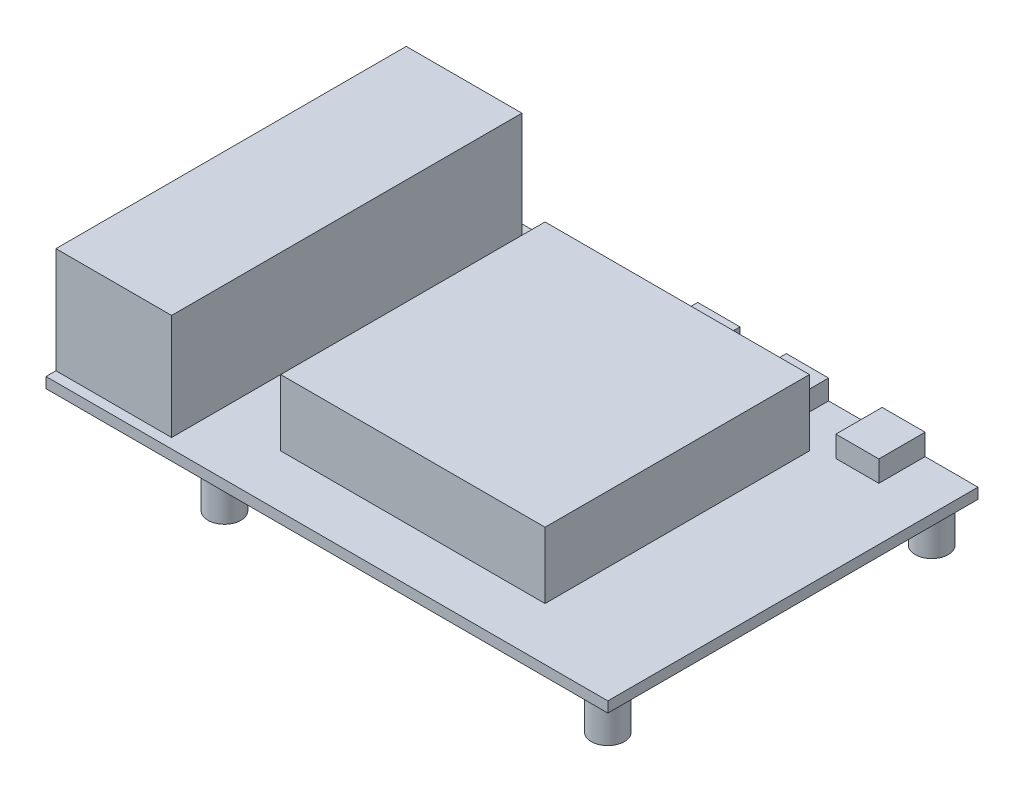
ISO-10303-21;
HEADER;
FILE_DESCRIPTION(('STEP AP214'),'2;1');
FILE_NAME('part.step','',(''),(''),'','','');
FILE_SCHEMA(('AUTOMOTIVE_DESIGN { 1 0 10303 214 1 1 1 1 }'));
ENDSEC;
DATA;
#1=APPLICATION_CONTEXT('core data for automotive mechanical design processes');
#2=APPLICATION_PROTOCOL_DEFINITION('international standard','automotive_design',2000,#1);
#3=PRODUCT_CONTEXT('',#1,'mechanical');
#4=PRODUCT('Part','Part','',(#3));
#5=PRODUCT_RELATED_PRODUCT_CATEGORY('part','',(#4));
#6=PRODUCT_DEFINITION_FORMATION('','',#4);
#7=PRODUCT_DEFINITION_CONTEXT('part definition',#1,'design');
#8=PRODUCT_DEFINITION('design','',#6,#7);
#9=PRODUCT_DEFINITION_SHAPE('','',#8);
#10=(LENGTH_UNIT() NAMED_UNIT(*) SI_UNIT(.MILLI.,.METRE.));
#11=(NAMED_UNIT(*) PLANE_ANGLE_UNIT() SI_UNIT($,.RADIAN.));
#12=(NAMED_UNIT(*) SI_UNIT($,.STERADIAN.) SOLID_ANGLE_UNIT());
#13=UNCERTAINTY_MEASURE_WITH_UNIT(LENGTH_MEASURE(1.E-05),#10,'distance_accuracy_value','');
#14=(GEOMETRIC_REPRESENTATION_CONTEXT(3) GLOBAL_UNCERTAINTY_ASSIGNED_CONTEXT((#13)) GLOBAL_UNIT_ASSIGNED_CONTEXT((#10,
#11,#12)) REPRESENTATION_CONTEXT('',''));
#15=CARTESIAN_POINT('',(0.,0.,0.));
#16=DIRECTION('',(0.,0.,1.));
#17=DIRECTION('',(1.,0.,0.));
#18=AXIS2_PLACEMENT_3D('',#15,#16,#17);
#19=CARTESIAN_POINT('',(-19.,6.,-24.5));
#20=DIRECTION('',(0.,-1.,0.));
#21=DIRECTION('',(0.,0.,-1.));
#22=AXIS2_PLACEMENT_3D('',#19,#20,#21);
#23=CYLINDRICAL_SURFACE('',#22,2.5);
#24=CARTESIAN_POINT('',(-19.,6.,-24.5));
#25=DIRECTION('',(0.,1.,0.));
#26=DIRECTION('',(0.,0.,1.));
#27=AXIS2_PLACEMENT_3D('',#24,#25,#26);
#28=CIRCLE('',#27,2.5);
#29=CARTESIAN_POINT('',(-19.,6.,-22.));
#30=VERTEX_POINT('',#29);
#31=EDGE_CURVE('E385',#30,#30,#28,.T.);
#32=ORIENTED_EDGE('',*,*,#31,.F.);
#33=EDGE_LOOP('',(#32));
#34=FACE_BOUND('',#33,.T.);
#35=CARTESIAN_POINT('',(-19.,0.,-24.5));
#36=DIRECTION('',(0.,1.,0.));
#37=DIRECTION('',(0.,0.,1.));
#38=AXIS2_PLACEMENT_3D('',#35,#36,#37);
#39=CIRCLE('',#38,2.5);
#40=CARTESIAN_POINT('',(-19.,0.,-22.));
#41=VERTEX_POINT('',#40);
#42=EDGE_CURVE('E381',#41,#41,#39,.T.);
#43=ORIENTED_EDGE('',*,*,#42,.T.);
#44=EDGE_LOOP('',(#43));
#45=FACE_BOUND('',#44,.T.);
#46=ADVANCED_FACE('F43',(#34,#45),#23,.T.);
#47=CARTESIAN_POINT('',(-19.,0.,-24.5));
#48=DIRECTION('',(0.,1.,0.));
#49=DIRECTION('',(0.,0.,1.));
#50=AXIS2_PLACEMENT_3D('',#47,#48,#49);
#51=PLANE('',#50);
#52=ORIENTED_EDGE('',*,*,#42,.F.);
#53=EDGE_LOOP('',(#52));
#54=FACE_BOUND('',#53,.T.);
#55=ADVANCED_FACE('F487',(#54),#51,.F.);
#56=CARTESIAN_POINT('',(-42.5,7.6,-28.));
#57=DIRECTION('',(1.,0.,0.));
#58=DIRECTION('',(0.,0.,-1.));
#59=AXIS2_PLACEMENT_3D('',#56,#57,#58);
#60=PLANE('',#59);
#61=DIRECTION('',(0.,0.,1.));
#62=VECTOR('',#61,1.);
#63=CARTESIAN_POINT('',(-42.5,6.,-28.));
#64=LINE('',#63,#62);
#65=CARTESIAN_POINT('',(-42.5,6.,-28.));
#66=VERTEX_POINT('',#65);
#67=CARTESIAN_POINT('',(-42.5,6.,28.));
#68=VERTEX_POINT('',#67);
#69=EDGE_CURVE('E350',#66,#68,#64,.T.);
#70=ORIENTED_EDGE('',*,*,#69,.T.);
#71=DIRECTION('',(0.,-1.,0.));
#72=VECTOR('',#71,1.);
#73=CARTESIAN_POINT('',(-42.5,7.6,28.));
#74=LINE('',#73,#72);
#75=CARTESIAN_POINT('',(-42.5,7.6,28.));
#76=VERTEX_POINT('',#75);
#77=EDGE_CURVE('E378',#76,#68,#74,.T.);
#78=ORIENTED_EDGE('',*,*,#77,.F.);
#79=DIRECTION('',(0.,0.,1.));
#80=VECTOR('',#79,1.);
#81=CARTESIAN_POINT('',(-42.5,7.6,-28.));
#82=LINE('',#81,#80);
#83=CARTESIAN_POINT('',(-42.5,7.6,26.5));
#84=VERTEX_POINT('',#83);
#85=EDGE_CURVE('E352',#84,#76,#82,.T.);
#86=ORIENTED_EDGE('',*,*,#85,.F.);
#87=DIRECTION('',(0.,-1.,0.));
#88=VECTOR('',#87,1.);
#89=CARTESIAN_POINT('',(-42.5,23.6,26.5));
#90=LINE('',#89,#88);
#91=CARTESIAN_POINT('',(-42.5,23.6,26.5));
#92=VERTEX_POINT('',#91);
#93=EDGE_CURVE('E304',#92,#84,#90,.T.);
#94=ORIENTED_EDGE('',*,*,#93,.F.);
#95=DIRECTION('',(0.,0.,1.));
#96=VECTOR('',#95,1.);
#97=CARTESIAN_POINT('',(-42.5,23.6,-26.5));
#98=LINE('',#97,#96);
#99=CARTESIAN_POINT('',(-42.5,23.6,-26.5));
#100=VERTEX_POINT('',#99);
#101=EDGE_CURVE('E278',#100,#92,#98,.T.);
#102=ORIENTED_EDGE('',*,*,#101,.F.);
#103=DIRECTION('',(0.,-1.,0.));
#104=VECTOR('',#103,1.);
#105=CARTESIAN_POINT('',(-42.5,23.6,-26.5));
#106=LINE('',#105,#104);
#107=CARTESIAN_POINT('',(-42.5,7.6,-26.5));
#108=VERTEX_POINT('',#107);
#109=EDGE_CURVE('E290',#100,#108,#106,.T.);
#110=ORIENTED_EDGE('',*,*,#109,.T.);
#111=CARTESIAN_POINT('',(-42.5,7.6,-28.));
#112=VERTEX_POINT('',#111);
#113=EDGE_CURVE('E346',#112,#108,#82,.T.);
#114=ORIENTED_EDGE('',*,*,#113,.F.);
#115=DIRECTION('',(0.,-1.,0.));
#116=VECTOR('',#115,1.);
#117=CARTESIAN_POINT('',(-42.5,7.6,-28.));
#118=LINE('',#117,#116);
#119=EDGE_CURVE('E360',#112,#66,#118,.T.);
#120=ORIENTED_EDGE('',*,*,#119,.T.);
#121=EDGE_LOOP('',(#70,#78,#86,#94,#102,#110,#114,#120));
#122=FACE_BOUND('',#121,.T.);
#123=ADVANCED_FACE('F411',(#122),#60,.F.);
#124=CARTESIAN_POINT('',(-42.5,7.6,28.));
#125=DIRECTION('',(0.,0.,-1.));
#126=DIRECTION('',(-1.,0.,0.));
#127=AXIS2_PLACEMENT_3D('',#124,#125,#126);
#128=PLANE('',#127);
#129=DIRECTION('',(1.,0.,0.));
#130=VECTOR('',#129,1.);
#131=CARTESIAN_POINT('',(-42.5,6.,28.));
#132=LINE('',#131,#130);
#133=CARTESIAN_POINT('',(42.5,6.,28.));
#134=VERTEX_POINT('',#133);
#135=EDGE_CURVE('E365',#68,#134,#132,.T.);
#136=ORIENTED_EDGE('',*,*,#135,.T.);
#137=DIRECTION('',(0.,-1.,0.));
#138=VECTOR('',#137,1.);
#139=CARTESIAN_POINT('',(42.5,7.6,28.));
#140=LINE('',#139,#138);
#141=CARTESIAN_POINT('',(42.5,7.6,28.));
#142=VERTEX_POINT('',#141);
#143=EDGE_CURVE('E374',#142,#134,#140,.T.);
#144=ORIENTED_EDGE('',*,*,#143,.F.);
#145=DIRECTION('',(1.,0.,0.));
#146=VECTOR('',#145,1.);
#147=CARTESIAN_POINT('',(-42.5,7.6,28.));
#148=LINE('',#147,#146);
#149=EDGE_CURVE('E351',#76,#142,#148,.T.);
#150=ORIENTED_EDGE('',*,*,#149,.F.);
#151=ORIENTED_EDGE('',*,*,#77,.T.);
#152=EDGE_LOOP('',(#136,#144,#150,#151));
#153=FACE_BOUND('',#152,.T.);
#154=ADVANCED_FACE('F426',(#153),#128,.F.);
#155=CARTESIAN_POINT('',(42.5,7.6,28.));
#156=DIRECTION('',(-1.,0.,0.));
#157=DIRECTION('',(0.,0.,1.));
#158=AXIS2_PLACEMENT_3D('',#155,#156,#157);
#159=PLANE('',#158);
#160=DIRECTION('',(0.,0.,-1.));
#161=VECTOR('',#160,1.);
#162=CARTESIAN_POINT('',(42.5,6.,28.));
#163=LINE('',#162,#161);
#164=CARTESIAN_POINT('',(42.5,6.,-28.));
#165=VERTEX_POINT('',#164);
#166=EDGE_CURVE('E368',#134,#165,#163,.T.);
#167=ORIENTED_EDGE('',*,*,#166,.T.);
#168=DIRECTION('',(0.,-1.,0.));
#169=VECTOR('',#168,1.);
#170=CARTESIAN_POINT('',(42.5,7.6,-28.));
#171=LINE('',#170,#169);
#172=CARTESIAN_POINT('',(42.5,7.6,-28.));
#173=VERTEX_POINT('',#172);
#174=EDGE_CURVE('E375',#173,#165,#171,.T.);
#175=ORIENTED_EDGE('',*,*,#174,.F.);
#176=DIRECTION('',(0.,0.,-1.));
#177=VECTOR('',#176,1.);
#178=CARTESIAN_POINT('',(42.5,7.6,28.));
#179=LINE('',#178,#177);
#180=EDGE_CURVE('E353',#142,#173,#179,.T.);
#181=ORIENTED_EDGE('',*,*,#180,.F.);
#182=ORIENTED_EDGE('',*,*,#143,.T.);
#183=EDGE_LOOP('',(#167,#175,#181,#182));
#184=FACE_BOUND('',#183,.T.);
#185=ADVANCED_FACE('F425',(#184),#159,.F.);
#186=CARTESIAN_POINT('',(42.5,7.6,-28.));
#187=DIRECTION('',(0.,0.,1.));
#188=DIRECTION('',(1.,0.,0.));
#189=AXIS2_PLACEMENT_3D('',#186,#187,#188);
#190=PLANE('',#189);
#191=DIRECTION('',(-1.,0.,0.));
#192=VECTOR('',#191,1.);
#193=CARTESIAN_POINT('',(42.5,6.,-28.));
#194=LINE('',#193,#192);
#195=EDGE_CURVE('E366',#165,#66,#194,.T.);
#196=ORIENTED_EDGE('',*,*,#195,.T.);
#197=ORIENTED_EDGE('',*,*,#119,.F.);
#198=DIRECTION('',(-1.,0.,0.));
#199=VECTOR('',#198,1.);
#200=CARTESIAN_POINT('',(42.5,7.6,-28.));
#201=LINE('',#200,#199);
#202=CARTESIAN_POINT('',(0.1,7.6,-28.));
#203=VERTEX_POINT('',#202);
#204=EDGE_CURVE('E356',#203,#112,#201,.T.);
#205=ORIENTED_EDGE('',*,*,#204,.F.);
#206=DIRECTION('',(0.,-1.,0.));
#207=VECTOR('',#206,1.);
#208=CARTESIAN_POINT('',(0.1,10.6,-28.));
#209=LINE('',#208,#207);
#210=CARTESIAN_POINT('',(0.1,10.6,-28.));
#211=VERTEX_POINT('',#210);
#212=EDGE_CURVE('E473',#211,#203,#209,.T.);
#213=ORIENTED_EDGE('',*,*,#212,.F.);
#214=DIRECTION('',(-1.,0.,0.));
#215=VECTOR('',#214,1.);
#216=CARTESIAN_POINT('',(6.5,10.6,-28.));
#217=LINE('',#216,#215);
#218=CARTESIAN_POINT('',(6.5,10.6,-28.));
#219=VERTEX_POINT('',#218);
#220=EDGE_CURVE('E218',#219,#211,#217,.T.);
#221=ORIENTED_EDGE('',*,*,#220,.F.);
#222=DIRECTION('',(0.,-1.,0.));
#223=VECTOR('',#222,1.);
#224=CARTESIAN_POINT('',(6.5,10.6,-28.));
#225=LINE('',#224,#223);
#226=CARTESIAN_POINT('',(6.5,7.6,-28.));
#227=VERTEX_POINT('',#226);
#228=EDGE_CURVE('E227',#219,#227,#225,.T.);
#229=ORIENTED_EDGE('',*,*,#228,.T.);
#230=CARTESIAN_POINT('',(13.5,7.6,-28.));
#231=VERTEX_POINT('',#230);
#232=EDGE_CURVE('E443',#231,#227,#201,.T.);
#233=ORIENTED_EDGE('',*,*,#232,.F.);
#234=DIRECTION('',(0.,-1.,0.));
#235=VECTOR('',#234,1.);
#236=CARTESIAN_POINT('',(13.5,10.6,-28.));
#237=LINE('',#236,#235);
#238=CARTESIAN_POINT('',(13.5,10.6,-28.));
#239=VERTEX_POINT('',#238);
#240=EDGE_CURVE('E238',#239,#231,#237,.T.);
#241=ORIENTED_EDGE('',*,*,#240,.F.);
#242=DIRECTION('',(-1.,0.,0.));
#243=VECTOR('',#242,1.);
#244=CARTESIAN_POINT('',(19.9,10.6,-28.));
#245=LINE('',#244,#243);
#246=CARTESIAN_POINT('',(19.9,10.6,-28.));
#247=VERTEX_POINT('',#246);
#248=EDGE_CURVE('E239',#247,#239,#245,.T.);
#249=ORIENTED_EDGE('',*,*,#248,.F.);
#250=DIRECTION('',(0.,-1.,0.));
#251=VECTOR('',#250,1.);
#252=CARTESIAN_POINT('',(19.9,10.6,-28.));
#253=LINE('',#252,#251);
#254=CARTESIAN_POINT('',(19.9,7.6,-28.));
#255=VERTEX_POINT('',#254);
#256=EDGE_CURVE('E245',#247,#255,#253,.T.);
#257=ORIENTED_EDGE('',*,*,#256,.T.);
#258=CARTESIAN_POINT('',(28.,7.6,-28.));
#259=VERTEX_POINT('',#258);
#260=EDGE_CURVE('E363',#259,#255,#201,.T.);
#261=ORIENTED_EDGE('',*,*,#260,.F.);
#262=DIRECTION('',(0.,-1.,0.));
#263=VECTOR('',#262,1.);
#264=CARTESIAN_POINT('',(28.,10.8,-28.));
#265=LINE('',#264,#263);
#266=CARTESIAN_POINT('',(28.,10.8,-28.));
#267=VERTEX_POINT('',#266);
#268=EDGE_CURVE('E262',#267,#259,#265,.T.);
#269=ORIENTED_EDGE('',*,*,#268,.F.);
#270=DIRECTION('',(-1.,0.,0.));
#271=VECTOR('',#270,1.);
#272=CARTESIAN_POINT('',(34.5,10.8,-28.));
#273=LINE('',#272,#271);
#274=CARTESIAN_POINT('',(34.5,10.8,-28.));
#275=VERTEX_POINT('',#274);
#276=EDGE_CURVE('E265',#275,#267,#273,.T.);
#277=ORIENTED_EDGE('',*,*,#276,.F.);
#278=DIRECTION('',(0.,-1.,0.));
#279=VECTOR('',#278,1.);
#280=CARTESIAN_POINT('',(34.5,10.8,-28.));
#281=LINE('',#280,#279);
#282=CARTESIAN_POINT('',(34.5,7.6,-28.));
#283=VERTEX_POINT('',#282);
#284=EDGE_CURVE('E269',#275,#283,#281,.T.);
#285=ORIENTED_EDGE('',*,*,#284,.T.);
#286=EDGE_CURVE('E357',#173,#283,#201,.T.);
#287=ORIENTED_EDGE('',*,*,#286,.F.);
#288=ORIENTED_EDGE('',*,*,#174,.T.);
#289=EDGE_LOOP('',(#196,#197,#205,#213,#221,#229,#233,#241,#249,#257,#261,#269,#277,#285,#287,#288));
#290=FACE_BOUND('',#289,.T.);
#291=ADVANCED_FACE('F417',(#290),#190,.F.);
#292=CARTESIAN_POINT('',(0.,7.6,0.));
#293=DIRECTION('',(0.,1.,0.));
#294=DIRECTION('',(0.,0.,1.));
#295=AXIS2_PLACEMENT_3D('',#292,#293,#294);
#296=PLANE('',#295);
#297=DIRECTION('',(0.,0.,1.));
#298=VECTOR('',#297,1.);
#299=CARTESIAN_POINT('',(0.1,7.6,-28.));
#300=LINE('',#299,#298);
#301=CARTESIAN_POINT('',(0.1,7.6,-21.));
#302=VERTEX_POINT('',#301);
#303=EDGE_CURVE('E60',#203,#302,#300,.T.);
#304=ORIENTED_EDGE('',*,*,#303,.F.);
#305=ORIENTED_EDGE('',*,*,#204,.T.);
#306=ORIENTED_EDGE('',*,*,#113,.T.);
#307=DIRECTION('',(-1.,0.,0.));
#308=VECTOR('',#307,1.);
#309=CARTESIAN_POINT('',(-25.,7.6,-26.5));
#310=LINE('',#309,#308);
#311=CARTESIAN_POINT('',(-25.,7.6,-26.5));
#312=VERTEX_POINT('',#311);
#313=EDGE_CURVE('E283',#312,#108,#310,.T.);
#314=ORIENTED_EDGE('',*,*,#313,.F.);
#315=DIRECTION('',(0.,0.,-1.));
#316=VECTOR('',#315,1.);
#317=CARTESIAN_POINT('',(-25.,7.6,26.5));
#318=LINE('',#317,#316);
#319=CARTESIAN_POINT('',(-25.,7.6,26.5));
#320=VERTEX_POINT('',#319);
#321=EDGE_CURVE('E291',#320,#312,#318,.T.);
#322=ORIENTED_EDGE('',*,*,#321,.F.);
#323=DIRECTION('',(1.,0.,0.));
#324=VECTOR('',#323,1.);
#325=CARTESIAN_POINT('',(-42.5,7.6,26.5));
#326=LINE('',#325,#324);
#327=EDGE_CURVE('E276',#84,#320,#326,.T.);
#328=ORIENTED_EDGE('',*,*,#327,.F.);
#329=ORIENTED_EDGE('',*,*,#85,.T.);
#330=ORIENTED_EDGE('',*,*,#149,.T.);
#331=ORIENTED_EDGE('',*,*,#180,.T.);
#332=ORIENTED_EDGE('',*,*,#286,.T.);
#333=DIRECTION('',(0.,0.,-1.));
#334=VECTOR('',#333,1.);
#335=CARTESIAN_POINT('',(34.5,7.6,-21.));
#336=LINE('',#335,#334);
#337=CARTESIAN_POINT('',(34.5,7.6,-21.));
#338=VERTEX_POINT('',#337);
#339=EDGE_CURVE('E256',#338,#283,#336,.T.);
#340=ORIENTED_EDGE('',*,*,#339,.F.);
#341=DIRECTION('',(1.,0.,0.));
#342=VECTOR('',#341,1.);
#343=CARTESIAN_POINT('',(28.,7.6,-21.));
#344=LINE('',#343,#342);
#345=CARTESIAN_POINT('',(28.,7.6,-21.));
#346=VERTEX_POINT('',#345);
#347=EDGE_CURVE('E266',#346,#338,#344,.T.);
#348=ORIENTED_EDGE('',*,*,#347,.F.);
#349=DIRECTION('',(0.,0.,1.));
#350=VECTOR('',#349,1.);
#351=CARTESIAN_POINT('',(28.,7.6,-28.));
#352=LINE('',#351,#350);
#353=EDGE_CURVE('E251',#259,#346,#352,.T.);
#354=ORIENTED_EDGE('',*,*,#353,.F.);
#355=ORIENTED_EDGE('',*,*,#260,.T.);
#356=DIRECTION('',(0.,0.,-1.));
#357=VECTOR('',#356,1.);
#358=CARTESIAN_POINT('',(19.9,7.6,-21.));
#359=LINE('',#358,#357);
#360=CARTESIAN_POINT('',(19.9,7.6,-21.));
#361=VERTEX_POINT('',#360);
#362=EDGE_CURVE('E235',#361,#255,#359,.T.);
#363=ORIENTED_EDGE('',*,*,#362,.F.);
#364=DIRECTION('',(1.,0.,0.));
#365=VECTOR('',#364,1.);
#366=CARTESIAN_POINT('',(13.5,7.6,-21.));
#367=LINE('',#366,#365);
#368=CARTESIAN_POINT('',(13.5,7.6,-21.));
#369=VERTEX_POINT('',#368);
#370=EDGE_CURVE('E223',#369,#361,#367,.T.);
#371=ORIENTED_EDGE('',*,*,#370,.F.);
#372=DIRECTION('',(0.,0.,1.));
#373=VECTOR('',#372,1.);
#374=CARTESIAN_POINT('',(13.5,7.6,-28.));
#375=LINE('',#374,#373);
#376=EDGE_CURVE('E65',#231,#369,#375,.T.);
#377=ORIENTED_EDGE('',*,*,#376,.F.);
#378=ORIENTED_EDGE('',*,*,#232,.T.);
#379=DIRECTION('',(0.,0.,-1.));
#380=VECTOR('',#379,1.);
#381=CARTESIAN_POINT('',(6.5,7.6,-21.));
#382=LINE('',#381,#380);
#383=CARTESIAN_POINT('',(6.5,7.6,-21.));
#384=VERTEX_POINT('',#383);
#385=EDGE_CURVE('E222',#384,#227,#382,.T.);
#386=ORIENTED_EDGE('',*,*,#385,.F.);
#387=DIRECTION('',(1.,0.,0.));
#388=VECTOR('',#387,1.);
#389=CARTESIAN_POINT('',(0.1,7.6,-21.));
#390=LINE('',#389,#388);
#391=EDGE_CURVE('E474',#302,#384,#390,.T.);
#392=ORIENTED_EDGE('',*,*,#391,.F.);
#393=EDGE_LOOP('',(#304,#305,#306,#314,#322,#328,#329,#330,#331,#332,#340,#348,#354,#355,#363,
#371,#377,#378,#386,#392));
#394=FACE_BOUND('',#393,.T.);
#395=DIRECTION('',(0.,0.,1.));
#396=VECTOR('',#395,1.);
#397=CARTESIAN_POINT('',(-15.,7.6,-20.));
#398=LINE('',#397,#396);
#399=CARTESIAN_POINT('',(-15.,7.6,-20.));
#400=VERTEX_POINT('',#399);
#401=CARTESIAN_POINT('',(-15.,7.6,20.));
#402=VERTEX_POINT('',#401);
#403=EDGE_CURVE('E305',#400,#402,#398,.T.);
#404=ORIENTED_EDGE('',*,*,#403,.F.);
#405=DIRECTION('',(-1.,0.,0.));
#406=VECTOR('',#405,1.);
#407=CARTESIAN_POINT('',(25.,7.6,-20.));
#408=LINE('',#407,#406);
#409=CARTESIAN_POINT('',(25.,7.6,-20.));
#410=VERTEX_POINT('',#409);
#411=EDGE_CURVE('E309',#410,#400,#408,.T.);
#412=ORIENTED_EDGE('',*,*,#411,.F.);
#413=DIRECTION('',(0.,0.,-1.));
#414=VECTOR('',#413,1.);
#415=CARTESIAN_POINT('',(25.,7.6,20.));
#416=LINE('',#415,#414);
#417=CARTESIAN_POINT('',(25.,7.6,20.));
#418=VERTEX_POINT('',#417);
#419=EDGE_CURVE('E325',#418,#410,#416,.T.);
#420=ORIENTED_EDGE('',*,*,#419,.F.);
#421=DIRECTION('',(1.,0.,0.));
#422=VECTOR('',#421,1.);
#423=CARTESIAN_POINT('',(-15.,7.6,20.));
#424=LINE('',#423,#422);
#425=EDGE_CURVE('E317',#402,#418,#424,.T.);
#426=ORIENTED_EDGE('',*,*,#425,.F.);
#427=EDGE_LOOP('',(#404,#412,#420,#426));
#428=FACE_BOUND('',#427,.T.);
#429=ADVANCED_FACE('F398',(#394,#428),#296,.T.);
#430=CARTESIAN_POINT('',(0.,6.,0.));
#431=DIRECTION('',(0.,1.,0.));
#432=DIRECTION('',(0.,0.,1.));
#433=AXIS2_PLACEMENT_3D('',#430,#431,#432);
#434=PLANE('',#433);
#435=CARTESIAN_POINT('',(39.,6.,24.5));
#436=DIRECTION('',(0.,1.,0.));
#437=DIRECTION('',(0.,0.,1.));
#438=AXIS2_PLACEMENT_3D('',#435,#436,#437);
#439=CIRCLE('',#438,2.5);
#440=CARTESIAN_POINT('',(39.,6.,27.));
#441=VERTEX_POINT('',#440);
#442=EDGE_CURVE('E11',#441,#441,#439,.F.);
#443=ORIENTED_EDGE('',*,*,#442,.F.);
#444=EDGE_LOOP('',(#443));
#445=FACE_BOUND('',#444,.T.);
#446=CARTESIAN_POINT('',(39.,6.,-24.5));
#447=DIRECTION('',(0.,1.,0.));
#448=DIRECTION('',(0.,0.,1.));
#449=AXIS2_PLACEMENT_3D('',#446,#447,#448);
#450=CIRCLE('',#449,2.5);
#451=CARTESIAN_POINT('',(39.,6.,-22.));
#452=VERTEX_POINT('',#451);
#453=EDGE_CURVE('E49',#452,#452,#450,.F.);
#454=ORIENTED_EDGE('',*,*,#453,.F.);
#455=EDGE_LOOP('',(#454));
#456=FACE_BOUND('',#455,.T.);
#457=CARTESIAN_POINT('',(-19.,6.,24.5));
#458=DIRECTION('',(0.,1.,0.));
#459=DIRECTION('',(0.,0.,1.));
#460=AXIS2_PLACEMENT_3D('',#457,#458,#459);
#461=CIRCLE('',#460,2.5);
#462=CARTESIAN_POINT('',(-19.,6.,27.));
#463=VERTEX_POINT('',#462);
#464=EDGE_CURVE('E384',#463,#463,#461,.F.);
#465=ORIENTED_EDGE('',*,*,#464,.F.);
#466=EDGE_LOOP('',(#465));
#467=FACE_BOUND('',#466,.T.);
#468=ORIENTED_EDGE('',*,*,#31,.T.);
#469=EDGE_LOOP('',(#468));
#470=FACE_BOUND('',#469,.T.);
#471=ORIENTED_EDGE('',*,*,#69,.F.);
#472=ORIENTED_EDGE('',*,*,#195,.F.);
#473=ORIENTED_EDGE('',*,*,#166,.F.);
#474=ORIENTED_EDGE('',*,*,#135,.F.);
#475=EDGE_LOOP('',(#471,#472,#473,#474));
#476=FACE_BOUND('',#475,.T.);
#477=ADVANCED_FACE('F395',(#445,#456,#467,#470,#476),#434,.F.);
#478=CARTESIAN_POINT('',(-19.,6.,24.5));
#479=DIRECTION('',(0.,-1.,0.));
#480=DIRECTION('',(0.,0.,-1.));
#481=AXIS2_PLACEMENT_3D('',#478,#479,#480);
#482=CYLINDRICAL_SURFACE('',#481,2.5);
#483=ORIENTED_EDGE('',*,*,#464,.T.);
#484=EDGE_LOOP('',(#483));
#485=FACE_BOUND('',#484,.T.);
#486=CARTESIAN_POINT('',(-19.,0.,24.5));
#487=DIRECTION('',(0.,1.,0.));
#488=DIRECTION('',(0.,0.,1.));
#489=AXIS2_PLACEMENT_3D('',#486,#487,#488);
#490=CIRCLE('',#489,2.5);
#491=CARTESIAN_POINT('',(-19.,0.,27.));
#492=VERTEX_POINT('',#491);
#493=EDGE_CURVE('E343',#492,#492,#490,.T.);
#494=ORIENTED_EDGE('',*,*,#493,.T.);
#495=EDGE_LOOP('',(#494));
#496=FACE_BOUND('',#495,.T.);
#497=ADVANCED_FACE('F399',(#485,#496),#482,.T.);
#498=CARTESIAN_POINT('',(-19.,0.,24.5));
#499=DIRECTION('',(0.,1.,0.));
#500=DIRECTION('',(0.,0.,1.));
#501=AXIS2_PLACEMENT_3D('',#498,#499,#500);
#502=PLANE('',#501);
#503=ORIENTED_EDGE('',*,*,#493,.F.);
#504=EDGE_LOOP('',(#503));
#505=FACE_BOUND('',#504,.T.);
#506=ADVANCED_FACE('F515',(#505),#502,.F.);
#507=CARTESIAN_POINT('',(39.,6.,-24.5));
#508=DIRECTION('',(0.,-1.,0.));
#509=DIRECTION('',(0.,0.,-1.));
#510=AXIS2_PLACEMENT_3D('',#507,#508,#509);
#511=CYLINDRICAL_SURFACE('',#510,2.5);
#512=ORIENTED_EDGE('',*,*,#453,.T.);
#513=EDGE_LOOP('',(#512));
#514=FACE_BOUND('',#513,.T.);
#515=CARTESIAN_POINT('',(39.,0.,-24.5));
#516=DIRECTION('',(0.,1.,0.));
#517=DIRECTION('',(0.,0.,1.));
#518=AXIS2_PLACEMENT_3D('',#515,#516,#517);
#519=CIRCLE('',#518,2.5);
#520=CARTESIAN_POINT('',(39.,0.,-22.));
#521=VERTEX_POINT('',#520);
#522=EDGE_CURVE('E341',#521,#521,#519,.T.);
#523=ORIENTED_EDGE('',*,*,#522,.T.);
#524=EDGE_LOOP('',(#523));
#525=FACE_BOUND('',#524,.T.);
#526=ADVANCED_FACE('F392',(#514,#525),#511,.T.);
#527=CARTESIAN_POINT('',(39.,0.,-24.5));
#528=DIRECTION('',(0.,1.,0.));
#529=DIRECTION('',(0.,0.,1.));
#530=AXIS2_PLACEMENT_3D('',#527,#528,#529);
#531=PLANE('',#530);
#532=ORIENTED_EDGE('',*,*,#522,.F.);
#533=EDGE_LOOP('',(#532));
#534=FACE_BOUND('',#533,.T.);
#535=ADVANCED_FACE('F518',(#534),#531,.F.);
#536=CARTESIAN_POINT('',(39.,6.,24.5));
#537=DIRECTION('',(0.,-1.,0.));
#538=DIRECTION('',(0.,0.,-1.));
#539=AXIS2_PLACEMENT_3D('',#536,#537,#538);
#540=CYLINDRICAL_SURFACE('',#539,2.5);
#541=ORIENTED_EDGE('',*,*,#442,.T.);
#542=EDGE_LOOP('',(#541));
#543=FACE_BOUND('',#542,.T.);
#544=CARTESIAN_POINT('',(39.,0.,24.5));
#545=DIRECTION('',(0.,1.,0.));
#546=DIRECTION('',(0.,0.,1.));
#547=AXIS2_PLACEMENT_3D('',#544,#545,#546);
#548=CIRCLE('',#547,2.5);
#549=CARTESIAN_POINT('',(39.,0.,27.));
#550=VERTEX_POINT('',#549);
#551=EDGE_CURVE('E339',#550,#550,#548,.T.);
#552=ORIENTED_EDGE('',*,*,#551,.T.);
#553=EDGE_LOOP('',(#552));
#554=FACE_BOUND('',#553,.T.);
#555=ADVANCED_FACE('F522',(#543,#554),#540,.T.);
#556=CARTESIAN_POINT('',(39.,0.,24.5));
#557=DIRECTION('',(0.,1.,0.));
#558=DIRECTION('',(0.,0.,1.));
#559=AXIS2_PLACEMENT_3D('',#556,#557,#558);
#560=PLANE('',#559);
#561=ORIENTED_EDGE('',*,*,#551,.F.);
#562=EDGE_LOOP('',(#561));
#563=FACE_BOUND('',#562,.T.);
#564=ADVANCED_FACE('F528',(#563),#560,.F.);
#565=CARTESIAN_POINT('',(-15.,17.6,-20.));
#566=DIRECTION('',(1.,0.,0.));
#567=DIRECTION('',(0.,0.,-1.));
#568=AXIS2_PLACEMENT_3D('',#565,#566,#567);
#569=PLANE('',#568);
#570=ORIENTED_EDGE('',*,*,#403,.T.);
#571=DIRECTION('',(0.,-1.,0.));
#572=VECTOR('',#571,1.);
#573=CARTESIAN_POINT('',(-15.,17.6,20.));
#574=LINE('',#573,#572);
#575=CARTESIAN_POINT('',(-15.,17.6,20.));
#576=VERTEX_POINT('',#575);
#577=EDGE_CURVE('E333',#576,#402,#574,.T.);
#578=ORIENTED_EDGE('',*,*,#577,.F.);
#579=DIRECTION('',(0.,0.,1.));
#580=VECTOR('',#579,1.);
#581=CARTESIAN_POINT('',(-15.,17.6,-20.));
#582=LINE('',#581,#580);
#583=CARTESIAN_POINT('',(-15.,17.6,-20.));
#584=VERTEX_POINT('',#583);
#585=EDGE_CURVE('E308',#584,#576,#582,.T.);
#586=ORIENTED_EDGE('',*,*,#585,.F.);
#587=DIRECTION('',(0.,-1.,0.));
#588=VECTOR('',#587,1.);
#589=CARTESIAN_POINT('',(-15.,17.6,-20.));
#590=LINE('',#589,#588);
#591=EDGE_CURVE('E316',#584,#400,#590,.T.);
#592=ORIENTED_EDGE('',*,*,#591,.T.);
#593=EDGE_LOOP('',(#570,#578,#586,#592));
#594=FACE_BOUND('',#593,.T.);
#595=ADVANCED_FACE('F529',(#594),#569,.F.);
#596=CARTESIAN_POINT('',(-15.,17.6,20.));
#597=DIRECTION('',(0.,0.,-1.));
#598=DIRECTION('',(-1.,0.,0.));
#599=AXIS2_PLACEMENT_3D('',#596,#597,#598);
#600=PLANE('',#599);
#601=ORIENTED_EDGE('',*,*,#425,.T.);
#602=DIRECTION('',(0.,-1.,0.));
#603=VECTOR('',#602,1.);
#604=CARTESIAN_POINT('',(25.,17.6,20.));
#605=LINE('',#604,#603);
#606=CARTESIAN_POINT('',(25.,17.6,20.));
#607=VERTEX_POINT('',#606);
#608=EDGE_CURVE('E335',#607,#418,#605,.T.);
#609=ORIENTED_EDGE('',*,*,#608,.F.);
#610=DIRECTION('',(1.,0.,0.));
#611=VECTOR('',#610,1.);
#612=CARTESIAN_POINT('',(-15.,17.6,20.));
#613=LINE('',#612,#611);
#614=EDGE_CURVE('E310',#576,#607,#613,.T.);
#615=ORIENTED_EDGE('',*,*,#614,.F.);
#616=ORIENTED_EDGE('',*,*,#577,.T.);
#617=EDGE_LOOP('',(#601,#609,#615,#616));
#618=FACE_BOUND('',#617,.T.);
#619=ADVANCED_FACE('F534',(#618),#600,.F.);
#620=CARTESIAN_POINT('',(25.,17.6,20.));
#621=DIRECTION('',(-1.,0.,0.));
#622=DIRECTION('',(0.,0.,1.));
#623=AXIS2_PLACEMENT_3D('',#620,#621,#622);
#624=PLANE('',#623);
#625=ORIENTED_EDGE('',*,*,#419,.T.);
#626=DIRECTION('',(0.,-1.,0.));
#627=VECTOR('',#626,1.);
#628=CARTESIAN_POINT('',(25.,17.6,-20.));
#629=LINE('',#628,#627);
#630=CARTESIAN_POINT('',(25.,17.6,-20.));
#631=VERTEX_POINT('',#630);
#632=EDGE_CURVE('E328',#631,#410,#629,.T.);
#633=ORIENTED_EDGE('',*,*,#632,.F.);
#634=DIRECTION('',(0.,0.,-1.));
#635=VECTOR('',#634,1.);
#636=CARTESIAN_POINT('',(25.,17.6,20.));
#637=LINE('',#636,#635);
#638=EDGE_CURVE('E315',#607,#631,#637,.T.);
#639=ORIENTED_EDGE('',*,*,#638,.F.);
#640=ORIENTED_EDGE('',*,*,#608,.T.);
#641=EDGE_LOOP('',(#625,#633,#639,#640));
#642=FACE_BOUND('',#641,.T.);
#643=ADVANCED_FACE('F538',(#642),#624,.F.);
#644=CARTESIAN_POINT('',(25.,17.6,-20.));
#645=DIRECTION('',(0.,0.,1.));
#646=DIRECTION('',(1.,0.,0.));
#647=AXIS2_PLACEMENT_3D('',#644,#645,#646);
#648=PLANE('',#647);
#649=ORIENTED_EDGE('',*,*,#411,.T.);
#650=ORIENTED_EDGE('',*,*,#591,.F.);
#651=DIRECTION('',(-1.,0.,0.));
#652=VECTOR('',#651,1.);
#653=CARTESIAN_POINT('',(25.,17.6,-20.));
#654=LINE('',#653,#652);
#655=EDGE_CURVE('E314',#631,#584,#654,.T.);
#656=ORIENTED_EDGE('',*,*,#655,.F.);
#657=ORIENTED_EDGE('',*,*,#632,.T.);
#658=EDGE_LOOP('',(#649,#650,#656,#657));
#659=FACE_BOUND('',#658,.T.);
#660=ADVANCED_FACE('F545',(#659),#648,.F.);
#661=CARTESIAN_POINT('',(0.,17.6,0.));
#662=DIRECTION('',(0.,1.,0.));
#663=DIRECTION('',(0.,0.,1.));
#664=AXIS2_PLACEMENT_3D('',#661,#662,#663);
#665=PLANE('',#664);
#666=ORIENTED_EDGE('',*,*,#585,.T.);
#667=ORIENTED_EDGE('',*,*,#614,.T.);
#668=ORIENTED_EDGE('',*,*,#638,.T.);
#669=ORIENTED_EDGE('',*,*,#655,.T.);
#670=EDGE_LOOP('',(#666,#667,#668,#669));
#671=FACE_BOUND('',#670,.T.);
#672=ADVANCED_FACE('F546',(#671),#665,.T.);
#673=CARTESIAN_POINT('',(-42.5,23.6,26.5));
#674=DIRECTION('',(0.,0.,-1.));
#675=DIRECTION('',(-1.,0.,0.));
#676=AXIS2_PLACEMENT_3D('',#673,#674,#675);
#677=PLANE('',#676);
#678=ORIENTED_EDGE('',*,*,#327,.T.);
#679=DIRECTION('',(0.,-1.,0.));
#680=VECTOR('',#679,1.);
#681=CARTESIAN_POINT('',(-25.,23.6,26.5));
#682=LINE('',#681,#680);
#683=CARTESIAN_POINT('',(-25.,23.6,26.5));
#684=VERTEX_POINT('',#683);
#685=EDGE_CURVE('E301',#684,#320,#682,.T.);
#686=ORIENTED_EDGE('',*,*,#685,.F.);
#687=DIRECTION('',(1.,0.,0.));
#688=VECTOR('',#687,1.);
#689=CARTESIAN_POINT('',(-42.5,23.6,26.5));
#690=LINE('',#689,#688);
#691=EDGE_CURVE('E284',#92,#684,#690,.T.);
#692=ORIENTED_EDGE('',*,*,#691,.F.);
#693=ORIENTED_EDGE('',*,*,#93,.T.);
#694=EDGE_LOOP('',(#678,#686,#692,#693));
#695=FACE_BOUND('',#694,.T.);
#696=ADVANCED_FACE('F432',(#695),#677,.F.);
#697=CARTESIAN_POINT('',(-25.,23.6,26.5));
#698=DIRECTION('',(-1.,0.,0.));
#699=DIRECTION('',(0.,0.,1.));
#700=AXIS2_PLACEMENT_3D('',#697,#698,#699);
#701=PLANE('',#700);
#702=ORIENTED_EDGE('',*,*,#321,.T.);
#703=DIRECTION('',(0.,-1.,0.));
#704=VECTOR('',#703,1.);
#705=CARTESIAN_POINT('',(-25.,23.6,-26.5));
#706=LINE('',#705,#704);
#707=CARTESIAN_POINT('',(-25.,23.6,-26.5));
#708=VERTEX_POINT('',#707);
#709=EDGE_CURVE('E299',#708,#312,#706,.T.);
#710=ORIENTED_EDGE('',*,*,#709,.F.);
#711=DIRECTION('',(0.,0.,-1.));
#712=VECTOR('',#711,1.);
#713=CARTESIAN_POINT('',(-25.,23.6,26.5));
#714=LINE('',#713,#712);
#715=EDGE_CURVE('E286',#684,#708,#714,.T.);
#716=ORIENTED_EDGE('',*,*,#715,.F.);
#717=ORIENTED_EDGE('',*,*,#685,.T.);
#718=EDGE_LOOP('',(#702,#710,#716,#717));
#719=FACE_BOUND('',#718,.T.);
#720=ADVANCED_FACE('F554',(#719),#701,.F.);
#721=CARTESIAN_POINT('',(-25.,23.6,-26.5));
#722=DIRECTION('',(0.,0.,1.));
#723=DIRECTION('',(1.,0.,0.));
#724=AXIS2_PLACEMENT_3D('',#721,#722,#723);
#725=PLANE('',#724);
#726=ORIENTED_EDGE('',*,*,#313,.T.);
#727=ORIENTED_EDGE('',*,*,#109,.F.);
#728=DIRECTION('',(-1.,0.,0.));
#729=VECTOR('',#728,1.);
#730=CARTESIAN_POINT('',(-25.,23.6,-26.5));
#731=LINE('',#730,#729);
#732=EDGE_CURVE('E289',#708,#100,#731,.T.);
#733=ORIENTED_EDGE('',*,*,#732,.F.);
#734=ORIENTED_EDGE('',*,*,#709,.T.);
#735=EDGE_LOOP('',(#726,#727,#733,#734));
#736=FACE_BOUND('',#735,.T.);
#737=ADVANCED_FACE('F444',(#736),#725,.F.);
#738=CARTESIAN_POINT('',(0.,23.6,0.));
#739=DIRECTION('',(0.,1.,0.));
#740=DIRECTION('',(0.,0.,1.));
#741=AXIS2_PLACEMENT_3D('',#738,#739,#740);
#742=PLANE('',#741);
#743=ORIENTED_EDGE('',*,*,#101,.T.);
#744=ORIENTED_EDGE('',*,*,#691,.T.);
#745=ORIENTED_EDGE('',*,*,#715,.T.);
#746=ORIENTED_EDGE('',*,*,#732,.T.);
#747=EDGE_LOOP('',(#743,#744,#745,#746));
#748=FACE_BOUND('',#747,.T.);
#749=ADVANCED_FACE('F437',(#748),#742,.T.);
#750=CARTESIAN_POINT('',(28.,10.8,-28.));
#751=DIRECTION('',(1.,0.,0.));
#752=DIRECTION('',(0.,0.,-1.));
#753=AXIS2_PLACEMENT_3D('',#750,#751,#752);
#754=PLANE('',#753);
#755=ORIENTED_EDGE('',*,*,#353,.T.);
#756=DIRECTION('',(0.,-1.,0.));
#757=VECTOR('',#756,1.);
#758=CARTESIAN_POINT('',(28.,10.8,-21.));
#759=LINE('',#758,#757);
#760=CARTESIAN_POINT('',(28.,10.8,-21.));
#761=VERTEX_POINT('',#760);
#762=EDGE_CURVE('E277',#761,#346,#759,.T.);
#763=ORIENTED_EDGE('',*,*,#762,.F.);
#764=DIRECTION('',(0.,0.,1.));
#765=VECTOR('',#764,1.);
#766=CARTESIAN_POINT('',(28.,10.8,-28.));
#767=LINE('',#766,#765);
#768=EDGE_CURVE('E255',#267,#761,#767,.T.);
#769=ORIENTED_EDGE('',*,*,#768,.F.);
#770=ORIENTED_EDGE('',*,*,#268,.T.);
#771=EDGE_LOOP('',(#755,#763,#769,#770));
#772=FACE_BOUND('',#771,.T.);
#773=ADVANCED_FACE('F561',(#772),#754,.F.);
#774=CARTESIAN_POINT('',(28.,10.8,-21.));
#775=DIRECTION('',(0.,0.,-1.));
#776=DIRECTION('',(-1.,0.,0.));
#777=AXIS2_PLACEMENT_3D('',#774,#775,#776);
#778=PLANE('',#777);
#779=ORIENTED_EDGE('',*,*,#347,.T.);
#780=DIRECTION('',(0.,-1.,0.));
#781=VECTOR('',#780,1.);
#782=CARTESIAN_POINT('',(34.5,10.8,-21.));
#783=LINE('',#782,#781);
#784=CARTESIAN_POINT('',(34.5,10.8,-21.));
#785=VERTEX_POINT('',#784);
#786=EDGE_CURVE('E272',#785,#338,#783,.T.);
#787=ORIENTED_EDGE('',*,*,#786,.F.);
#788=DIRECTION('',(1.,0.,0.));
#789=VECTOR('',#788,1.);
#790=CARTESIAN_POINT('',(28.,10.8,-21.));
#791=LINE('',#790,#789);
#792=EDGE_CURVE('E260',#761,#785,#791,.T.);
#793=ORIENTED_EDGE('',*,*,#792,.F.);
#794=ORIENTED_EDGE('',*,*,#762,.T.);
#795=EDGE_LOOP('',(#779,#787,#793,#794));
#796=FACE_BOUND('',#795,.T.);
#797=ADVANCED_FACE('F563',(#796),#778,.F.);
#798=CARTESIAN_POINT('',(34.5,10.8,-21.));
#799=DIRECTION('',(-1.,0.,0.));
#800=DIRECTION('',(0.,0.,1.));
#801=AXIS2_PLACEMENT_3D('',#798,#799,#800);
#802=PLANE('',#801);
#803=ORIENTED_EDGE('',*,*,#339,.T.);
#804=ORIENTED_EDGE('',*,*,#284,.F.);
#805=DIRECTION('',(0.,0.,-1.));
#806=VECTOR('',#805,1.);
#807=CARTESIAN_POINT('',(34.5,10.8,-21.));
#808=LINE('',#807,#806);
#809=EDGE_CURVE('E257',#785,#275,#808,.T.);
#810=ORIENTED_EDGE('',*,*,#809,.F.);
#811=ORIENTED_EDGE('',*,*,#786,.T.);
#812=EDGE_LOOP('',(#803,#804,#810,#811));
#813=FACE_BOUND('',#812,.T.);
#814=ADVANCED_FACE('F566',(#813),#802,.F.);
#815=CARTESIAN_POINT('',(0.,10.8,0.));
#816=DIRECTION('',(0.,1.,0.));
#817=DIRECTION('',(0.,0.,1.));
#818=AXIS2_PLACEMENT_3D('',#815,#816,#817);
#819=PLANE('',#818);
#820=ORIENTED_EDGE('',*,*,#768,.T.);
#821=ORIENTED_EDGE('',*,*,#792,.T.);
#822=ORIENTED_EDGE('',*,*,#809,.T.);
#823=ORIENTED_EDGE('',*,*,#276,.T.);
#824=EDGE_LOOP('',(#820,#821,#822,#823));
#825=FACE_BOUND('',#824,.T.);
#826=ADVANCED_FACE('F572',(#825),#819,.T.);
#827=CARTESIAN_POINT('',(13.5,10.6,-28.));
#828=DIRECTION('',(1.,0.,0.));
#829=DIRECTION('',(0.,0.,-1.));
#830=AXIS2_PLACEMENT_3D('',#827,#828,#829);
#831=PLANE('',#830);
#832=ORIENTED_EDGE('',*,*,#376,.T.);
#833=DIRECTION('',(0.,-1.,0.));
#834=VECTOR('',#833,1.);
#835=CARTESIAN_POINT('',(13.5,10.6,-21.));
#836=LINE('',#835,#834);
#837=CARTESIAN_POINT('',(13.5,10.6,-21.));
#838=VERTEX_POINT('',#837);
#839=EDGE_CURVE('E253',#838,#369,#836,.T.);
#840=ORIENTED_EDGE('',*,*,#839,.F.);
#841=DIRECTION('',(0.,0.,1.));
#842=VECTOR('',#841,1.);
#843=CARTESIAN_POINT('',(13.5,10.6,-28.));
#844=LINE('',#843,#842);
#845=EDGE_CURVE('E231',#239,#838,#844,.T.);
#846=ORIENTED_EDGE('',*,*,#845,.F.);
#847=ORIENTED_EDGE('',*,*,#240,.T.);
#848=EDGE_LOOP('',(#832,#840,#846,#847));
#849=FACE_BOUND('',#848,.T.);
#850=ADVANCED_FACE('F576',(#849),#831,.F.);
#851=CARTESIAN_POINT('',(13.5,10.6,-21.));
#852=DIRECTION('',(0.,0.,-1.));
#853=DIRECTION('',(-1.,0.,0.));
#854=AXIS2_PLACEMENT_3D('',#851,#852,#853);
#855=PLANE('',#854);
#856=ORIENTED_EDGE('',*,*,#370,.T.);
#857=DIRECTION('',(0.,-1.,0.));
#858=VECTOR('',#857,1.);
#859=CARTESIAN_POINT('',(19.9,10.6,-21.));
#860=LINE('',#859,#858);
#861=CARTESIAN_POINT('',(19.9,10.6,-21.));
#862=VERTEX_POINT('',#861);
#863=EDGE_CURVE('E249',#862,#361,#860,.T.);
#864=ORIENTED_EDGE('',*,*,#863,.F.);
#865=DIRECTION('',(1.,0.,0.));
#866=VECTOR('',#865,1.);
#867=CARTESIAN_POINT('',(13.5,10.6,-21.));
#868=LINE('',#867,#866);
#869=EDGE_CURVE('E233',#838,#862,#868,.T.);
#870=ORIENTED_EDGE('',*,*,#869,.F.);
#871=ORIENTED_EDGE('',*,*,#839,.T.);
#872=EDGE_LOOP('',(#856,#864,#870,#871));
#873=FACE_BOUND('',#872,.T.);
#874=ADVANCED_FACE('F466',(#873),#855,.F.);
#875=CARTESIAN_POINT('',(19.9,10.6,-21.));
#876=DIRECTION('',(-1.,0.,0.));
#877=DIRECTION('',(0.,0.,1.));
#878=AXIS2_PLACEMENT_3D('',#875,#876,#877);
#879=PLANE('',#878);
#880=ORIENTED_EDGE('',*,*,#362,.T.);
#881=ORIENTED_EDGE('',*,*,#256,.F.);
#882=DIRECTION('',(0.,0.,-1.));
#883=VECTOR('',#882,1.);
#884=CARTESIAN_POINT('',(19.9,10.6,-21.));
#885=LINE('',#884,#883);
#886=EDGE_CURVE('E240',#862,#247,#885,.T.);
#887=ORIENTED_EDGE('',*,*,#886,.F.);
#888=ORIENTED_EDGE('',*,*,#863,.T.);
#889=EDGE_LOOP('',(#880,#881,#887,#888));
#890=FACE_BOUND('',#889,.T.);
#891=ADVANCED_FACE('F464',(#890),#879,.F.);
#892=CARTESIAN_POINT('',(0.,10.6,0.));
#893=DIRECTION('',(0.,1.,0.));
#894=DIRECTION('',(0.,0.,1.));
#895=AXIS2_PLACEMENT_3D('',#892,#893,#894);
#896=PLANE('',#895);
#897=ORIENTED_EDGE('',*,*,#845,.T.);
#898=ORIENTED_EDGE('',*,*,#869,.T.);
#899=ORIENTED_EDGE('',*,*,#886,.T.);
#900=ORIENTED_EDGE('',*,*,#248,.T.);
#901=EDGE_LOOP('',(#897,#898,#899,#900));
#902=FACE_BOUND('',#901,.T.);
#903=ADVANCED_FACE('F585',(#902),#896,.T.);
#904=CARTESIAN_POINT('',(0.1,10.6,-28.));
#905=DIRECTION('',(1.,0.,0.));
#906=DIRECTION('',(0.,0.,-1.));
#907=AXIS2_PLACEMENT_3D('',#904,#905,#906);
#908=PLANE('',#907);
#909=ORIENTED_EDGE('',*,*,#303,.T.);
#910=DIRECTION('',(0.,-1.,0.));
#911=VECTOR('',#910,1.);
#912=CARTESIAN_POINT('',(0.1,10.6,-21.));
#913=LINE('',#912,#911);
#914=CARTESIAN_POINT('',(0.1,10.6,-21.));
#915=VERTEX_POINT('',#914);
#916=EDGE_CURVE('E210',#915,#302,#913,.T.);
#917=ORIENTED_EDGE('',*,*,#916,.F.);
#918=DIRECTION('',(0.,0.,1.));
#919=VECTOR('',#918,1.);
#920=CARTESIAN_POINT('',(0.1,10.6,-28.));
#921=LINE('',#920,#919);
#922=EDGE_CURVE('E212',#211,#915,#921,.T.);
#923=ORIENTED_EDGE('',*,*,#922,.F.);
#924=ORIENTED_EDGE('',*,*,#212,.T.);
#925=EDGE_LOOP('',(#909,#917,#923,#924));
#926=FACE_BOUND('',#925,.T.);
#927=ADVANCED_FACE('F224',(#926),#908,.F.);
#928=CARTESIAN_POINT('',(0.1,10.6,-21.));
#929=DIRECTION('',(0.,0.,-1.));
#930=DIRECTION('',(-1.,0.,0.));
#931=AXIS2_PLACEMENT_3D('',#928,#929,#930);
#932=PLANE('',#931);
#933=ORIENTED_EDGE('',*,*,#391,.T.);
#934=DIRECTION('',(0.,-1.,0.));
#935=VECTOR('',#934,1.);
#936=CARTESIAN_POINT('',(6.5,10.6,-21.));
#937=LINE('',#936,#935);
#938=CARTESIAN_POINT('',(6.5,10.6,-21.));
#939=VERTEX_POINT('',#938);
#940=EDGE_CURVE('E209',#939,#384,#937,.T.);
#941=ORIENTED_EDGE('',*,*,#940,.F.);
#942=DIRECTION('',(1.,0.,0.));
#943=VECTOR('',#942,1.);
#944=CARTESIAN_POINT('',(0.1,10.6,-21.));
#945=LINE('',#944,#943);
#946=EDGE_CURVE('E204',#915,#939,#945,.T.);
#947=ORIENTED_EDGE('',*,*,#946,.F.);
#948=ORIENTED_EDGE('',*,*,#916,.T.);
#949=EDGE_LOOP('',(#933,#941,#947,#948));
#950=FACE_BOUND('',#949,.T.);
#951=ADVANCED_FACE('F206',(#950),#932,.F.);
#952=CARTESIAN_POINT('',(6.5,10.6,-21.));
#953=DIRECTION('',(-1.,0.,0.));
#954=DIRECTION('',(0.,0.,1.));
#955=AXIS2_PLACEMENT_3D('',#952,#953,#954);
#956=PLANE('',#955);
#957=ORIENTED_EDGE('',*,*,#385,.T.);
#958=ORIENTED_EDGE('',*,*,#228,.F.);
#959=DIRECTION('',(0.,0.,-1.));
#960=VECTOR('',#959,1.);
#961=CARTESIAN_POINT('',(6.5,10.6,-21.));
#962=LINE('',#961,#960);
#963=EDGE_CURVE('E213',#939,#219,#962,.T.);
#964=ORIENTED_EDGE('',*,*,#963,.F.);
#965=ORIENTED_EDGE('',*,*,#940,.T.);
#966=EDGE_LOOP('',(#957,#958,#964,#965));
#967=FACE_BOUND('',#966,.T.);
#968=ADVANCED_FACE('F479',(#967),#956,.F.);
#969=CARTESIAN_POINT('',(0.,10.6,0.));
#970=DIRECTION('',(0.,1.,0.));
#971=DIRECTION('',(0.,0.,1.));
#972=AXIS2_PLACEMENT_3D('',#969,#970,#971);
#973=PLANE('',#972);
#974=ORIENTED_EDGE('',*,*,#922,.T.);
#975=ORIENTED_EDGE('',*,*,#946,.T.);
#976=ORIENTED_EDGE('',*,*,#963,.T.);
#977=ORIENTED_EDGE('',*,*,#220,.T.);
#978=EDGE_LOOP('',(#974,#975,#976,#977));
#979=FACE_BOUND('',#978,.T.);
#980=ADVANCED_FACE('F220',(#979),#973,.T.);
#981=CLOSED_SHELL('',(#46,#55,#123,#154,#185,#291,#429,#477,#497,#506,#526,#535,#555,#564,#595,
#619,#643,#660,#672,#696,#720,#737,#749,#773,#797,#814,#826,#850,#874,#891,#903,#927,#951,#968,#980));
#982=MANIFOLD_SOLID_BREP('B2',#981);
#983=ADVANCED_BREP_SHAPE_REPRESENTATION('',(#18,#982),#14);
#984=SHAPE_DEFINITION_REPRESENTATION(#9,#983);
ENDSEC;
END-ISO-10303-21;
